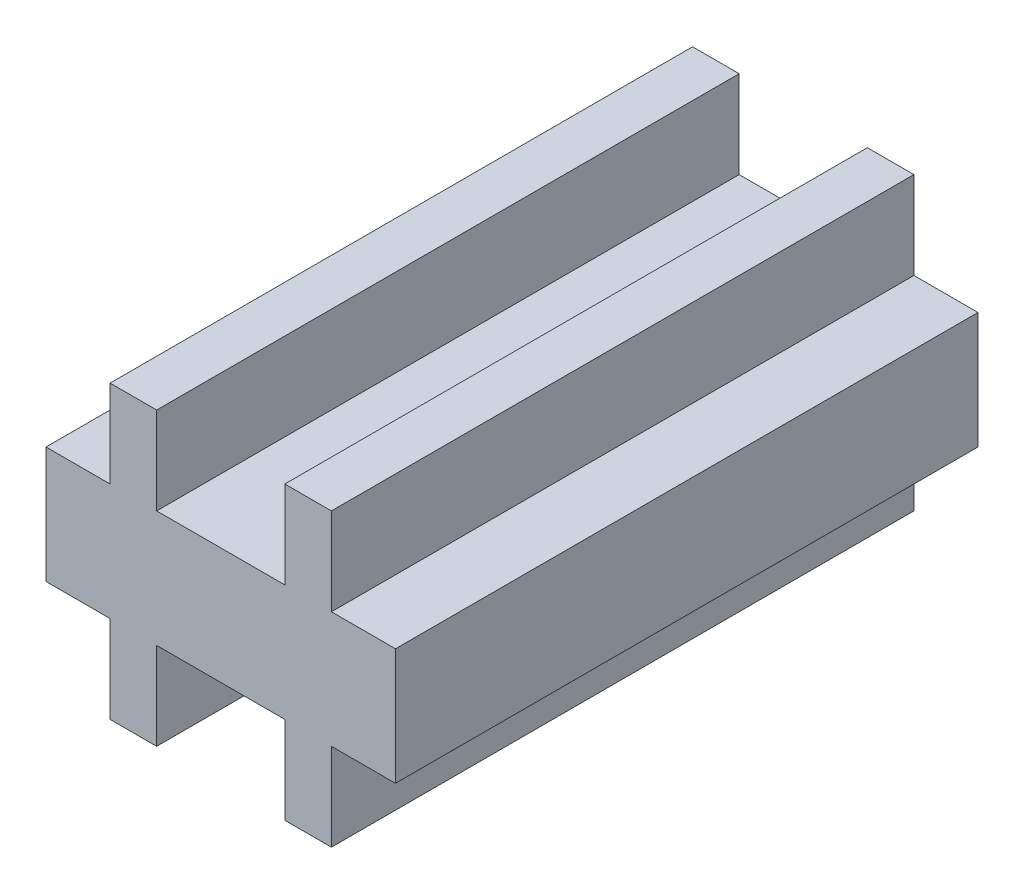
ISO-10303-21;
HEADER;
FILE_DESCRIPTION(('STEP AP214'),'2;1');
FILE_NAME('part.step','',(''),(''),'','','');
FILE_SCHEMA(('AUTOMOTIVE_DESIGN { 1 0 10303 214 1 1 1 1 }'));
ENDSEC;
DATA;
#1=APPLICATION_CONTEXT('core data for automotive mechanical design processes');
#2=APPLICATION_PROTOCOL_DEFINITION('international standard','automotive_design',2000,#1);
#3=PRODUCT_CONTEXT('',#1,'mechanical');
#4=PRODUCT('Part','Part','',(#3));
#5=PRODUCT_RELATED_PRODUCT_CATEGORY('part','',(#4));
#6=PRODUCT_DEFINITION_FORMATION('','',#4);
#7=PRODUCT_DEFINITION_CONTEXT('part definition',#1,'design');
#8=PRODUCT_DEFINITION('design','',#6,#7);
#9=PRODUCT_DEFINITION_SHAPE('','',#8);
#10=(LENGTH_UNIT() NAMED_UNIT(*) SI_UNIT(.MILLI.,.METRE.));
#11=(NAMED_UNIT(*) PLANE_ANGLE_UNIT() SI_UNIT($,.RADIAN.));
#12=(NAMED_UNIT(*) SI_UNIT($,.STERADIAN.) SOLID_ANGLE_UNIT());
#13=UNCERTAINTY_MEASURE_WITH_UNIT(LENGTH_MEASURE(1.E-05),#10,'distance_accuracy_value','');
#14=(GEOMETRIC_REPRESENTATION_CONTEXT(3) GLOBAL_UNCERTAINTY_ASSIGNED_CONTEXT((#13)) GLOBAL_UNIT_ASSIGNED_CONTEXT((#10,
#11,#12)) REPRESENTATION_CONTEXT('',''));
#15=CARTESIAN_POINT('',(0.,0.,0.));
#16=DIRECTION('',(0.,0.,1.));
#17=DIRECTION('',(1.,0.,0.));
#18=AXIS2_PLACEMENT_3D('',#15,#16,#17);
#19=CARTESIAN_POINT('',(0.,10.,100.));
#20=DIRECTION('',(0.,1.,0.));
#21=DIRECTION('',(0.,0.,1.));
#22=AXIS2_PLACEMENT_3D('',#19,#20,#21);
#23=PLANE('',#22);
#24=DIRECTION('',(1.,0.,0.));
#25=VECTOR('',#24,1.);
#26=CARTESIAN_POINT('',(0.,10.,0.));
#27=LINE('',#26,#25);
#28=CARTESIAN_POINT('',(3.99999999999999,10.,0.));
#29=VERTEX_POINT('',#28);
#30=CARTESIAN_POINT('',(15.,10.,0.));
#31=VERTEX_POINT('',#30);
#32=EDGE_CURVE('E147',#29,#31,#27,.T.);
#33=ORIENTED_EDGE('',*,*,#32,.F.);
#34=DIRECTION('',(0.,0.,-1.));
#35=VECTOR('',#34,1.);
#36=CARTESIAN_POINT('',(3.99999999999999,10.,100.));
#37=LINE('',#36,#35);
#38=CARTESIAN_POINT('',(3.99999999999999,10.,100.));
#39=VERTEX_POINT('',#38);
#40=EDGE_CURVE('E11',#39,#29,#37,.T.);
#41=ORIENTED_EDGE('',*,*,#40,.F.);
#42=DIRECTION('',(1.,0.,0.));
#43=VECTOR('',#42,1.);
#44=CARTESIAN_POINT('',(0.,10.,100.));
#45=LINE('',#44,#43);
#46=CARTESIAN_POINT('',(15.,10.,100.));
#47=VERTEX_POINT('',#46);
#48=EDGE_CURVE('E175',#39,#47,#45,.T.);
#49=ORIENTED_EDGE('',*,*,#48,.T.);
#50=DIRECTION('',(0.,0.,-1.));
#51=VECTOR('',#50,1.);
#52=CARTESIAN_POINT('',(15.,10.,100.));
#53=LINE('',#52,#51);
#54=EDGE_CURVE('E95',#47,#31,#53,.T.);
#55=ORIENTED_EDGE('',*,*,#54,.T.);
#56=EDGE_LOOP('',(#33,#41,#49,#55));
#57=FACE_BOUND('',#56,.T.);
#58=ADVANCED_FACE('F37',(#57),#23,.T.);
#59=CARTESIAN_POINT('',(3.99999999999999,0.,100.));
#60=DIRECTION('',(-1.,0.,0.));
#61=DIRECTION('',(0.,0.,1.));
#62=AXIS2_PLACEMENT_3D('',#59,#60,#61);
#63=PLANE('',#62);
#64=DIRECTION('',(0.,1.,0.));
#65=VECTOR('',#64,1.);
#66=CARTESIAN_POINT('',(3.99999999999999,0.,0.));
#67=LINE('',#66,#65);
#68=CARTESIAN_POINT('',(3.99999999999999,25.,0.));
#69=VERTEX_POINT('',#68);
#70=EDGE_CURVE('E150',#29,#69,#67,.T.);
#71=ORIENTED_EDGE('',*,*,#70,.T.);
#72=DIRECTION('',(0.,0.,-1.));
#73=VECTOR('',#72,1.);
#74=CARTESIAN_POINT('',(3.99999999999999,25.,100.));
#75=LINE('',#74,#73);
#76=CARTESIAN_POINT('',(3.99999999999999,25.,100.));
#77=VERTEX_POINT('',#76);
#78=EDGE_CURVE('E45',#77,#69,#75,.T.);
#79=ORIENTED_EDGE('',*,*,#78,.F.);
#80=DIRECTION('',(0.,1.,0.));
#81=VECTOR('',#80,1.);
#82=CARTESIAN_POINT('',(3.99999999999999,0.,100.));
#83=LINE('',#82,#81);
#84=EDGE_CURVE('E208',#39,#77,#83,.T.);
#85=ORIENTED_EDGE('',*,*,#84,.F.);
#86=ORIENTED_EDGE('',*,*,#40,.T.);
#87=EDGE_LOOP('',(#71,#79,#85,#86));
#88=FACE_BOUND('',#87,.T.);
#89=ADVANCED_FACE('F195',(#88),#63,.F.);
#90=CARTESIAN_POINT('',(0.,25.,100.));
#91=DIRECTION('',(0.,1.,0.));
#92=DIRECTION('',(0.,0.,1.));
#93=AXIS2_PLACEMENT_3D('',#90,#91,#92);
#94=PLANE('',#93);
#95=DIRECTION('',(1.,0.,0.));
#96=VECTOR('',#95,1.);
#97=CARTESIAN_POINT('',(0.,25.,0.));
#98=LINE('',#97,#96);
#99=CARTESIAN_POINT('',(-4.00000000000001,25.,0.));
#100=VERTEX_POINT('',#99);
#101=EDGE_CURVE('E154',#100,#69,#98,.T.);
#102=ORIENTED_EDGE('',*,*,#101,.F.);
#103=DIRECTION('',(0.,0.,-1.));
#104=VECTOR('',#103,1.);
#105=CARTESIAN_POINT('',(-4.00000000000001,25.,100.));
#106=LINE('',#105,#104);
#107=CARTESIAN_POINT('',(-4.00000000000001,25.,100.));
#108=VERTEX_POINT('',#107);
#109=EDGE_CURVE('E185',#108,#100,#106,.T.);
#110=ORIENTED_EDGE('',*,*,#109,.F.);
#111=DIRECTION('',(1.,0.,0.));
#112=VECTOR('',#111,1.);
#113=CARTESIAN_POINT('',(0.,25.,100.));
#114=LINE('',#113,#112);
#115=EDGE_CURVE('E192',#108,#77,#114,.T.);
#116=ORIENTED_EDGE('',*,*,#115,.T.);
#117=ORIENTED_EDGE('',*,*,#78,.T.);
#118=EDGE_LOOP('',(#102,#110,#116,#117));
#119=FACE_BOUND('',#118,.T.);
#120=ADVANCED_FACE('F190',(#119),#94,.T.);
#121=CARTESIAN_POINT('',(-4.00000000000001,0.,100.));
#122=DIRECTION('',(-1.,0.,0.));
#123=DIRECTION('',(0.,0.,1.));
#124=AXIS2_PLACEMENT_3D('',#121,#122,#123);
#125=PLANE('',#124);
#126=DIRECTION('',(0.,1.,0.));
#127=VECTOR('',#126,1.);
#128=CARTESIAN_POINT('',(-4.00000000000001,0.,0.));
#129=LINE('',#128,#127);
#130=CARTESIAN_POINT('',(-4.00000000000001,10.,0.));
#131=VERTEX_POINT('',#130);
#132=EDGE_CURVE('E157',#131,#100,#129,.T.);
#133=ORIENTED_EDGE('',*,*,#132,.F.);
#134=DIRECTION('',(0.,0.,-1.));
#135=VECTOR('',#134,1.);
#136=CARTESIAN_POINT('',(-4.00000000000001,10.,100.));
#137=LINE('',#136,#135);
#138=CARTESIAN_POINT('',(-4.00000000000001,10.,100.));
#139=VERTEX_POINT('',#138);
#140=EDGE_CURVE('E183',#139,#131,#137,.T.);
#141=ORIENTED_EDGE('',*,*,#140,.F.);
#142=DIRECTION('',(0.,1.,0.));
#143=VECTOR('',#142,1.);
#144=CARTESIAN_POINT('',(-4.00000000000001,0.,100.));
#145=LINE('',#144,#143);
#146=EDGE_CURVE('E205',#139,#108,#145,.T.);
#147=ORIENTED_EDGE('',*,*,#146,.T.);
#148=ORIENTED_EDGE('',*,*,#109,.T.);
#149=EDGE_LOOP('',(#133,#141,#147,#148));
#150=FACE_BOUND('',#149,.T.);
#151=ADVANCED_FACE('F202',(#150),#125,.T.);
#152=CARTESIAN_POINT('',(0.,10.,100.));
#153=DIRECTION('',(0.,1.,0.));
#154=DIRECTION('',(0.,0.,1.));
#155=AXIS2_PLACEMENT_3D('',#152,#153,#154);
#156=PLANE('',#155);
#157=DIRECTION('',(1.,0.,0.));
#158=VECTOR('',#157,1.);
#159=CARTESIAN_POINT('',(0.,10.,0.));
#160=LINE('',#159,#158);
#161=CARTESIAN_POINT('',(-26.,10.,0.));
#162=VERTEX_POINT('',#161);
#163=EDGE_CURVE('E160',#162,#131,#160,.T.);
#164=ORIENTED_EDGE('',*,*,#163,.F.);
#165=DIRECTION('',(0.,0.,-1.));
#166=VECTOR('',#165,1.);
#167=CARTESIAN_POINT('',(-26.,10.,100.));
#168=LINE('',#167,#166);
#169=CARTESIAN_POINT('',(-26.,10.,100.));
#170=VERTEX_POINT('',#169);
#171=EDGE_CURVE('E273',#170,#162,#168,.T.);
#172=ORIENTED_EDGE('',*,*,#171,.F.);
#173=DIRECTION('',(1.,0.,0.));
#174=VECTOR('',#173,1.);
#175=CARTESIAN_POINT('',(0.,10.,100.));
#176=LINE('',#175,#174);
#177=EDGE_CURVE('E210',#170,#139,#176,.T.);
#178=ORIENTED_EDGE('',*,*,#177,.T.);
#179=ORIENTED_EDGE('',*,*,#140,.T.);
#180=EDGE_LOOP('',(#164,#172,#178,#179));
#181=FACE_BOUND('',#180,.T.);
#182=ADVANCED_FACE('F535',(#181),#156,.T.);
#183=CARTESIAN_POINT('',(0.,-10.,100.));
#184=DIRECTION('',(0.,1.,0.));
#185=DIRECTION('',(0.,0.,1.));
#186=AXIS2_PLACEMENT_3D('',#183,#184,#185);
#187=PLANE('',#186);
#188=DIRECTION('',(1.,0.,0.));
#189=VECTOR('',#188,1.);
#190=CARTESIAN_POINT('',(0.,-10.,0.));
#191=LINE('',#190,#189);
#192=CARTESIAN_POINT('',(-26.,-10.,0.));
#193=VERTEX_POINT('',#192);
#194=CARTESIAN_POINT('',(-4.00000000000001,-10.,0.));
#195=VERTEX_POINT('',#194);
#196=EDGE_CURVE('E163',#193,#195,#191,.T.);
#197=ORIENTED_EDGE('',*,*,#196,.T.);
#198=DIRECTION('',(0.,0.,-1.));
#199=VECTOR('',#198,1.);
#200=CARTESIAN_POINT('',(-4.00000000000001,-10.,100.));
#201=LINE('',#200,#199);
#202=CARTESIAN_POINT('',(-4.00000000000001,-10.,100.));
#203=VERTEX_POINT('',#202);
#204=EDGE_CURVE('E181',#203,#195,#201,.T.);
#205=ORIENTED_EDGE('',*,*,#204,.F.);
#206=DIRECTION('',(1.,0.,0.));
#207=VECTOR('',#206,1.);
#208=CARTESIAN_POINT('',(0.,-10.,100.));
#209=LINE('',#208,#207);
#210=CARTESIAN_POINT('',(-26.,-10.,100.));
#211=VERTEX_POINT('',#210);
#212=EDGE_CURVE('E216',#211,#203,#209,.T.);
#213=ORIENTED_EDGE('',*,*,#212,.F.);
#214=DIRECTION('',(0.,0.,-1.));
#215=VECTOR('',#214,1.);
#216=CARTESIAN_POINT('',(-26.,-10.,100.));
#217=LINE('',#216,#215);
#218=EDGE_CURVE('E236',#211,#193,#217,.T.);
#219=ORIENTED_EDGE('',*,*,#218,.T.);
#220=EDGE_LOOP('',(#197,#205,#213,#219));
#221=FACE_BOUND('',#220,.T.);
#222=ADVANCED_FACE('F233',(#221),#187,.F.);
#223=CARTESIAN_POINT('',(-4.00000000000001,0.,100.));
#224=DIRECTION('',(-1.,0.,0.));
#225=DIRECTION('',(0.,0.,1.));
#226=AXIS2_PLACEMENT_3D('',#223,#224,#225);
#227=PLANE('',#226);
#228=DIRECTION('',(0.,1.,0.));
#229=VECTOR('',#228,1.);
#230=CARTESIAN_POINT('',(-4.00000000000001,0.,0.));
#231=LINE('',#230,#229);
#232=CARTESIAN_POINT('',(-4.00000000000001,-25.,0.));
#233=VERTEX_POINT('',#232);
#234=EDGE_CURVE('E166',#233,#195,#231,.T.);
#235=ORIENTED_EDGE('',*,*,#234,.F.);
#236=DIRECTION('',(0.,0.,-1.));
#237=VECTOR('',#236,1.);
#238=CARTESIAN_POINT('',(-4.00000000000001,-25.,100.));
#239=LINE('',#238,#237);
#240=CARTESIAN_POINT('',(-4.00000000000001,-25.,100.));
#241=VERTEX_POINT('',#240);
#242=EDGE_CURVE('E179',#241,#233,#239,.T.);
#243=ORIENTED_EDGE('',*,*,#242,.F.);
#244=DIRECTION('',(0.,1.,0.));
#245=VECTOR('',#244,1.);
#246=CARTESIAN_POINT('',(-4.00000000000001,0.,100.));
#247=LINE('',#246,#245);
#248=EDGE_CURVE('E218',#241,#203,#247,.T.);
#249=ORIENTED_EDGE('',*,*,#248,.T.);
#250=ORIENTED_EDGE('',*,*,#204,.T.);
#251=EDGE_LOOP('',(#235,#243,#249,#250));
#252=FACE_BOUND('',#251,.T.);
#253=ADVANCED_FACE('F222',(#252),#227,.T.);
#254=CARTESIAN_POINT('',(0.,-25.,100.));
#255=DIRECTION('',(0.,1.,0.));
#256=DIRECTION('',(0.,0.,1.));
#257=AXIS2_PLACEMENT_3D('',#254,#255,#256);
#258=PLANE('',#257);
#259=DIRECTION('',(1.,0.,0.));
#260=VECTOR('',#259,1.);
#261=CARTESIAN_POINT('',(0.,-25.,0.));
#262=LINE('',#261,#260);
#263=CARTESIAN_POINT('',(3.99999999999999,-25.,0.));
#264=VERTEX_POINT('',#263);
#265=EDGE_CURVE('E169',#233,#264,#262,.T.);
#266=ORIENTED_EDGE('',*,*,#265,.T.);
#267=DIRECTION('',(0.,0.,-1.));
#268=VECTOR('',#267,1.);
#269=CARTESIAN_POINT('',(3.99999999999999,-25.,100.));
#270=LINE('',#269,#268);
#271=CARTESIAN_POINT('',(3.99999999999999,-25.,100.));
#272=VERTEX_POINT('',#271);
#273=EDGE_CURVE('E139',#272,#264,#270,.T.);
#274=ORIENTED_EDGE('',*,*,#273,.F.);
#275=DIRECTION('',(1.,0.,0.));
#276=VECTOR('',#275,1.);
#277=CARTESIAN_POINT('',(0.,-25.,100.));
#278=LINE('',#277,#276);
#279=EDGE_CURVE('E130',#241,#272,#278,.T.);
#280=ORIENTED_EDGE('',*,*,#279,.F.);
#281=ORIENTED_EDGE('',*,*,#242,.T.);
#282=EDGE_LOOP('',(#266,#274,#280,#281));
#283=FACE_BOUND('',#282,.T.);
#284=ADVANCED_FACE('F241',(#283),#258,.F.);
#285=CARTESIAN_POINT('',(3.99999999999999,0.,100.));
#286=DIRECTION('',(-1.,0.,0.));
#287=DIRECTION('',(0.,0.,1.));
#288=AXIS2_PLACEMENT_3D('',#285,#286,#287);
#289=PLANE('',#288);
#290=DIRECTION('',(0.,1.,0.));
#291=VECTOR('',#290,1.);
#292=CARTESIAN_POINT('',(3.99999999999999,0.,0.));
#293=LINE('',#292,#291);
#294=CARTESIAN_POINT('',(3.99999999999999,-10.,0.));
#295=VERTEX_POINT('',#294);
#296=EDGE_CURVE('E138',#264,#295,#293,.T.);
#297=ORIENTED_EDGE('',*,*,#296,.T.);
#298=DIRECTION('',(0.,0.,-1.));
#299=VECTOR('',#298,1.);
#300=CARTESIAN_POINT('',(3.99999999999999,-10.,100.));
#301=LINE('',#300,#299);
#302=CARTESIAN_POINT('',(3.99999999999999,-10.,100.));
#303=VERTEX_POINT('',#302);
#304=EDGE_CURVE('E135',#303,#295,#301,.T.);
#305=ORIENTED_EDGE('',*,*,#304,.F.);
#306=DIRECTION('',(0.,1.,0.));
#307=VECTOR('',#306,1.);
#308=CARTESIAN_POINT('',(3.99999999999999,0.,100.));
#309=LINE('',#308,#307);
#310=EDGE_CURVE('E123',#272,#303,#309,.T.);
#311=ORIENTED_EDGE('',*,*,#310,.F.);
#312=ORIENTED_EDGE('',*,*,#273,.T.);
#313=EDGE_LOOP('',(#297,#305,#311,#312));
#314=FACE_BOUND('',#313,.T.);
#315=ADVANCED_FACE('F136',(#314),#289,.F.);
#316=CARTESIAN_POINT('',(0.,-10.,100.));
#317=DIRECTION('',(0.,1.,0.));
#318=DIRECTION('',(0.,0.,1.));
#319=AXIS2_PLACEMENT_3D('',#316,#317,#318);
#320=PLANE('',#319);
#321=DIRECTION('',(1.,0.,0.));
#322=VECTOR('',#321,1.);
#323=CARTESIAN_POINT('',(0.,-10.,0.));
#324=LINE('',#323,#322);
#325=CARTESIAN_POINT('',(15.,-10.,0.));
#326=VERTEX_POINT('',#325);
#327=EDGE_CURVE('E88',#295,#326,#324,.T.);
#328=ORIENTED_EDGE('',*,*,#327,.T.);
#329=DIRECTION('',(0.,0.,-1.));
#330=VECTOR('',#329,1.);
#331=CARTESIAN_POINT('',(15.,-10.,100.));
#332=LINE('',#331,#330);
#333=CARTESIAN_POINT('',(15.,-10.,100.));
#334=VERTEX_POINT('',#333);
#335=EDGE_CURVE('E140',#334,#326,#332,.T.);
#336=ORIENTED_EDGE('',*,*,#335,.F.);
#337=DIRECTION('',(1.,0.,0.));
#338=VECTOR('',#337,1.);
#339=CARTESIAN_POINT('',(0.,-10.,100.));
#340=LINE('',#339,#338);
#341=EDGE_CURVE('E127',#303,#334,#340,.T.);
#342=ORIENTED_EDGE('',*,*,#341,.F.);
#343=ORIENTED_EDGE('',*,*,#304,.T.);
#344=EDGE_LOOP('',(#328,#336,#342,#343));
#345=FACE_BOUND('',#344,.T.);
#346=ADVANCED_FACE('F142',(#345),#320,.F.);
#347=CARTESIAN_POINT('',(15.,0.,100.));
#348=DIRECTION('',(-1.,0.,0.));
#349=DIRECTION('',(0.,0.,1.));
#350=AXIS2_PLACEMENT_3D('',#347,#348,#349);
#351=PLANE('',#350);
#352=DIRECTION('',(0.,1.,0.));
#353=VECTOR('',#352,1.);
#354=CARTESIAN_POINT('',(15.,0.,0.));
#355=LINE('',#354,#353);
#356=EDGE_CURVE('E173',#326,#31,#355,.T.);
#357=ORIENTED_EDGE('',*,*,#356,.T.);
#358=ORIENTED_EDGE('',*,*,#54,.F.);
#359=DIRECTION('',(0.,1.,0.));
#360=VECTOR('',#359,1.);
#361=CARTESIAN_POINT('',(15.,0.,100.));
#362=LINE('',#361,#360);
#363=EDGE_CURVE('E53',#334,#47,#362,.T.);
#364=ORIENTED_EDGE('',*,*,#363,.F.);
#365=ORIENTED_EDGE('',*,*,#335,.T.);
#366=EDGE_LOOP('',(#357,#358,#364,#365));
#367=FACE_BOUND('',#366,.T.);
#368=ADVANCED_FACE('F256',(#367),#351,.F.);
#369=CARTESIAN_POINT('',(0.,0.,100.));
#370=DIRECTION('',(0.,0.,1.));
#371=DIRECTION('',(1.,0.,0.));
#372=AXIS2_PLACEMENT_3D('',#369,#370,#371);
#373=PLANE('',#372);
#374=ORIENTED_EDGE('',*,*,#48,.F.);
#375=ORIENTED_EDGE('',*,*,#84,.T.);
#376=ORIENTED_EDGE('',*,*,#115,.F.);
#377=ORIENTED_EDGE('',*,*,#146,.F.);
#378=ORIENTED_EDGE('',*,*,#177,.F.);
#379=DIRECTION('',(0.,1.,0.));
#380=VECTOR('',#379,1.);
#381=CARTESIAN_POINT('',(-26.,0.,100.));
#382=LINE('',#381,#380);
#383=CARTESIAN_POINT('',(-26.,25.,100.));
#384=VERTEX_POINT('',#383);
#385=EDGE_CURVE('E318',#170,#384,#382,.T.);
#386=ORIENTED_EDGE('',*,*,#385,.T.);
#387=DIRECTION('',(-1.,0.,0.));
#388=VECTOR('',#387,1.);
#389=CARTESIAN_POINT('',(-30.,25.,100.));
#390=LINE('',#389,#388);
#391=CARTESIAN_POINT('',(-34.,25.,100.));
#392=VERTEX_POINT('',#391);
#393=EDGE_CURVE('E315',#384,#392,#390,.T.);
#394=ORIENTED_EDGE('',*,*,#393,.T.);
#395=DIRECTION('',(0.,1.,0.));
#396=VECTOR('',#395,1.);
#397=CARTESIAN_POINT('',(-34.,0.,100.));
#398=LINE('',#397,#396);
#399=CARTESIAN_POINT('',(-34.,10.,100.));
#400=VERTEX_POINT('',#399);
#401=EDGE_CURVE('E285',#400,#392,#398,.T.);
#402=ORIENTED_EDGE('',*,*,#401,.F.);
#403=DIRECTION('',(-1.,0.,0.));
#404=VECTOR('',#403,1.);
#405=CARTESIAN_POINT('',(-30.,10.,100.));
#406=LINE('',#405,#404);
#407=CARTESIAN_POINT('',(-45.,10.,100.));
#408=VERTEX_POINT('',#407);
#409=EDGE_CURVE('E289',#400,#408,#406,.T.);
#410=ORIENTED_EDGE('',*,*,#409,.T.);
#411=DIRECTION('',(0.,1.,0.));
#412=VECTOR('',#411,1.);
#413=CARTESIAN_POINT('',(-45.,0.,100.));
#414=LINE('',#413,#412);
#415=CARTESIAN_POINT('',(-45.,-10.,100.));
#416=VERTEX_POINT('',#415);
#417=EDGE_CURVE('E331',#416,#408,#414,.T.);
#418=ORIENTED_EDGE('',*,*,#417,.F.);
#419=DIRECTION('',(-1.,0.,0.));
#420=VECTOR('',#419,1.);
#421=CARTESIAN_POINT('',(-30.,-10.,100.));
#422=LINE('',#421,#420);
#423=CARTESIAN_POINT('',(-34.,-10.,100.));
#424=VERTEX_POINT('',#423);
#425=EDGE_CURVE('E328',#424,#416,#422,.T.);
#426=ORIENTED_EDGE('',*,*,#425,.F.);
#427=DIRECTION('',(0.,1.,0.));
#428=VECTOR('',#427,1.);
#429=CARTESIAN_POINT('',(-34.,0.,100.));
#430=LINE('',#429,#428);
#431=CARTESIAN_POINT('',(-34.,-25.,100.));
#432=VERTEX_POINT('',#431);
#433=EDGE_CURVE('E325',#432,#424,#430,.T.);
#434=ORIENTED_EDGE('',*,*,#433,.F.);
#435=DIRECTION('',(-1.,0.,0.));
#436=VECTOR('',#435,1.);
#437=CARTESIAN_POINT('',(-30.,-25.,100.));
#438=LINE('',#437,#436);
#439=CARTESIAN_POINT('',(-26.,-25.,100.));
#440=VERTEX_POINT('',#439);
#441=EDGE_CURVE('E322',#440,#432,#438,.T.);
#442=ORIENTED_EDGE('',*,*,#441,.F.);
#443=DIRECTION('',(0.,1.,0.));
#444=VECTOR('',#443,1.);
#445=CARTESIAN_POINT('',(-26.,0.,100.));
#446=LINE('',#445,#444);
#447=EDGE_CURVE('E229',#440,#211,#446,.T.);
#448=ORIENTED_EDGE('',*,*,#447,.T.);
#449=ORIENTED_EDGE('',*,*,#212,.T.);
#450=ORIENTED_EDGE('',*,*,#248,.F.);
#451=ORIENTED_EDGE('',*,*,#279,.T.);
#452=ORIENTED_EDGE('',*,*,#310,.T.);
#453=ORIENTED_EDGE('',*,*,#341,.T.);
#454=ORIENTED_EDGE('',*,*,#363,.T.);
#455=EDGE_LOOP('',(#374,#375,#376,#377,#378,#386,#394,#402,#410,#418,#426,#434,#442,#448,#449,
#450,#451,#452,#453,#454));
#456=FACE_BOUND('',#455,.T.);
#457=ADVANCED_FACE('F125',(#456),#373,.T.);
#458=CARTESIAN_POINT('',(0.,0.,0.));
#459=DIRECTION('',(0.,0.,1.));
#460=DIRECTION('',(1.,0.,0.));
#461=AXIS2_PLACEMENT_3D('',#458,#459,#460);
#462=PLANE('',#461);
#463=ORIENTED_EDGE('',*,*,#32,.T.);
#464=ORIENTED_EDGE('',*,*,#356,.F.);
#465=ORIENTED_EDGE('',*,*,#327,.F.);
#466=ORIENTED_EDGE('',*,*,#296,.F.);
#467=ORIENTED_EDGE('',*,*,#265,.F.);
#468=ORIENTED_EDGE('',*,*,#234,.T.);
#469=ORIENTED_EDGE('',*,*,#196,.F.);
#470=DIRECTION('',(0.,1.,0.));
#471=VECTOR('',#470,1.);
#472=CARTESIAN_POINT('',(-26.,0.,0.));
#473=LINE('',#472,#471);
#474=CARTESIAN_POINT('',(-26.,-25.,0.));
#475=VERTEX_POINT('',#474);
#476=EDGE_CURVE('E296',#475,#193,#473,.T.);
#477=ORIENTED_EDGE('',*,*,#476,.F.);
#478=DIRECTION('',(-1.,0.,0.));
#479=VECTOR('',#478,1.);
#480=CARTESIAN_POINT('',(-30.,-25.,0.));
#481=LINE('',#480,#479);
#482=CARTESIAN_POINT('',(-34.,-25.,0.));
#483=VERTEX_POINT('',#482);
#484=EDGE_CURVE('E298',#475,#483,#481,.T.);
#485=ORIENTED_EDGE('',*,*,#484,.T.);
#486=DIRECTION('',(0.,1.,0.));
#487=VECTOR('',#486,1.);
#488=CARTESIAN_POINT('',(-34.,0.,0.));
#489=LINE('',#488,#487);
#490=CARTESIAN_POINT('',(-34.,-10.,0.));
#491=VERTEX_POINT('',#490);
#492=EDGE_CURVE('E301',#483,#491,#489,.T.);
#493=ORIENTED_EDGE('',*,*,#492,.T.);
#494=DIRECTION('',(-1.,0.,0.));
#495=VECTOR('',#494,1.);
#496=CARTESIAN_POINT('',(-30.,-10.,0.));
#497=LINE('',#496,#495);
#498=CARTESIAN_POINT('',(-45.,-10.,0.));
#499=VERTEX_POINT('',#498);
#500=EDGE_CURVE('E304',#491,#499,#497,.T.);
#501=ORIENTED_EDGE('',*,*,#500,.T.);
#502=DIRECTION('',(0.,1.,0.));
#503=VECTOR('',#502,1.);
#504=CARTESIAN_POINT('',(-45.,0.,0.));
#505=LINE('',#504,#503);
#506=CARTESIAN_POINT('',(-45.,10.,0.));
#507=VERTEX_POINT('',#506);
#508=EDGE_CURVE('E307',#499,#507,#505,.T.);
#509=ORIENTED_EDGE('',*,*,#508,.T.);
#510=DIRECTION('',(-1.,0.,0.));
#511=VECTOR('',#510,1.);
#512=CARTESIAN_POINT('',(-30.,10.,0.));
#513=LINE('',#512,#511);
#514=CARTESIAN_POINT('',(-34.,10.,0.));
#515=VERTEX_POINT('',#514);
#516=EDGE_CURVE('E310',#515,#507,#513,.T.);
#517=ORIENTED_EDGE('',*,*,#516,.F.);
#518=DIRECTION('',(0.,1.,0.));
#519=VECTOR('',#518,1.);
#520=CARTESIAN_POINT('',(-34.,0.,0.));
#521=LINE('',#520,#519);
#522=CARTESIAN_POINT('',(-34.,25.,0.));
#523=VERTEX_POINT('',#522);
#524=EDGE_CURVE('E286',#515,#523,#521,.T.);
#525=ORIENTED_EDGE('',*,*,#524,.T.);
#526=DIRECTION('',(-1.,0.,0.));
#527=VECTOR('',#526,1.);
#528=CARTESIAN_POINT('',(-30.,25.,0.));
#529=LINE('',#528,#527);
#530=CARTESIAN_POINT('',(-26.,25.,0.));
#531=VERTEX_POINT('',#530);
#532=EDGE_CURVE('E290',#531,#523,#529,.T.);
#533=ORIENTED_EDGE('',*,*,#532,.F.);
#534=DIRECTION('',(0.,1.,0.));
#535=VECTOR('',#534,1.);
#536=CARTESIAN_POINT('',(-26.,0.,0.));
#537=LINE('',#536,#535);
#538=EDGE_CURVE('E293',#162,#531,#537,.T.);
#539=ORIENTED_EDGE('',*,*,#538,.F.);
#540=ORIENTED_EDGE('',*,*,#163,.T.);
#541=ORIENTED_EDGE('',*,*,#132,.T.);
#542=ORIENTED_EDGE('',*,*,#101,.T.);
#543=ORIENTED_EDGE('',*,*,#70,.F.);
#544=EDGE_LOOP('',(#463,#464,#465,#466,#467,#468,#469,#477,#485,#493,#501,#509,#517,#525,#533,
#539,#540,#541,#542,#543));
#545=FACE_BOUND('',#544,.T.);
#546=ADVANCED_FACE('F197',(#545),#462,.F.);
#547=CARTESIAN_POINT('',(-30.,10.,100.));
#548=DIRECTION('',(0.,-1.,0.));
#549=DIRECTION('',(0.,0.,-1.));
#550=AXIS2_PLACEMENT_3D('',#547,#548,#549);
#551=PLANE('',#550);
#552=ORIENTED_EDGE('',*,*,#516,.T.);
#553=DIRECTION('',(0.,0.,-1.));
#554=VECTOR('',#553,1.);
#555=CARTESIAN_POINT('',(-45.,10.,100.));
#556=LINE('',#555,#554);
#557=EDGE_CURVE('E151',#408,#507,#556,.T.);
#558=ORIENTED_EDGE('',*,*,#557,.F.);
#559=ORIENTED_EDGE('',*,*,#409,.F.);
#560=DIRECTION('',(0.,0.,-1.));
#561=VECTOR('',#560,1.);
#562=CARTESIAN_POINT('',(-34.,10.,100.));
#563=LINE('',#562,#561);
#564=EDGE_CURVE('E282',#400,#515,#563,.T.);
#565=ORIENTED_EDGE('',*,*,#564,.T.);
#566=EDGE_LOOP('',(#552,#558,#559,#565));
#567=FACE_BOUND('',#566,.T.);
#568=ADVANCED_FACE('F344',(#567),#551,.F.);
#569=CARTESIAN_POINT('',(-45.,0.,100.));
#570=DIRECTION('',(-1.,0.,0.));
#571=DIRECTION('',(0.,0.,1.));
#572=AXIS2_PLACEMENT_3D('',#569,#570,#571);
#573=PLANE('',#572);
#574=ORIENTED_EDGE('',*,*,#508,.F.);
#575=DIRECTION('',(0.,0.,-1.));
#576=VECTOR('',#575,1.);
#577=CARTESIAN_POINT('',(-45.,-10.,100.));
#578=LINE('',#577,#576);
#579=EDGE_CURVE('E260',#416,#499,#578,.T.);
#580=ORIENTED_EDGE('',*,*,#579,.F.);
#581=ORIENTED_EDGE('',*,*,#417,.T.);
#582=ORIENTED_EDGE('',*,*,#557,.T.);
#583=EDGE_LOOP('',(#574,#580,#581,#582));
#584=FACE_BOUND('',#583,.T.);
#585=ADVANCED_FACE('F350',(#584),#573,.T.);
#586=CARTESIAN_POINT('',(-30.,-10.,100.));
#587=DIRECTION('',(0.,-1.,0.));
#588=DIRECTION('',(0.,0.,-1.));
#589=AXIS2_PLACEMENT_3D('',#586,#587,#588);
#590=PLANE('',#589);
#591=ORIENTED_EDGE('',*,*,#500,.F.);
#592=DIRECTION('',(0.,0.,-1.));
#593=VECTOR('',#592,1.);
#594=CARTESIAN_POINT('',(-34.,-10.,100.));
#595=LINE('',#594,#593);
#596=EDGE_CURVE('E263',#424,#491,#595,.T.);
#597=ORIENTED_EDGE('',*,*,#596,.F.);
#598=ORIENTED_EDGE('',*,*,#425,.T.);
#599=ORIENTED_EDGE('',*,*,#579,.T.);
#600=EDGE_LOOP('',(#591,#597,#598,#599));
#601=FACE_BOUND('',#600,.T.);
#602=ADVANCED_FACE('F356',(#601),#590,.T.);
#603=CARTESIAN_POINT('',(-34.,0.,100.));
#604=DIRECTION('',(-1.,0.,0.));
#605=DIRECTION('',(0.,0.,1.));
#606=AXIS2_PLACEMENT_3D('',#603,#604,#605);
#607=PLANE('',#606);
#608=ORIENTED_EDGE('',*,*,#492,.F.);
#609=DIRECTION('',(0.,0.,-1.));
#610=VECTOR('',#609,1.);
#611=CARTESIAN_POINT('',(-34.,-25.,100.));
#612=LINE('',#611,#610);
#613=EDGE_CURVE('E266',#432,#483,#612,.T.);
#614=ORIENTED_EDGE('',*,*,#613,.F.);
#615=ORIENTED_EDGE('',*,*,#433,.T.);
#616=ORIENTED_EDGE('',*,*,#596,.T.);
#617=EDGE_LOOP('',(#608,#614,#615,#616));
#618=FACE_BOUND('',#617,.T.);
#619=ADVANCED_FACE('F399',(#618),#607,.T.);
#620=CARTESIAN_POINT('',(-30.,-25.,100.));
#621=DIRECTION('',(0.,-1.,0.));
#622=DIRECTION('',(0.,0.,-1.));
#623=AXIS2_PLACEMENT_3D('',#620,#621,#622);
#624=PLANE('',#623);
#625=ORIENTED_EDGE('',*,*,#484,.F.);
#626=DIRECTION('',(0.,0.,-1.));
#627=VECTOR('',#626,1.);
#628=CARTESIAN_POINT('',(-26.,-25.,100.));
#629=LINE('',#628,#627);
#630=EDGE_CURVE('E269',#440,#475,#629,.T.);
#631=ORIENTED_EDGE('',*,*,#630,.F.);
#632=ORIENTED_EDGE('',*,*,#441,.T.);
#633=ORIENTED_EDGE('',*,*,#613,.T.);
#634=EDGE_LOOP('',(#625,#631,#632,#633));
#635=FACE_BOUND('',#634,.T.);
#636=ADVANCED_FACE('F395',(#635),#624,.T.);
#637=CARTESIAN_POINT('',(-26.,0.,100.));
#638=DIRECTION('',(-1.,0.,0.));
#639=DIRECTION('',(0.,0.,1.));
#640=AXIS2_PLACEMENT_3D('',#637,#638,#639);
#641=PLANE('',#640);
#642=ORIENTED_EDGE('',*,*,#476,.T.);
#643=ORIENTED_EDGE('',*,*,#218,.F.);
#644=ORIENTED_EDGE('',*,*,#447,.F.);
#645=ORIENTED_EDGE('',*,*,#630,.T.);
#646=EDGE_LOOP('',(#642,#643,#644,#645));
#647=FACE_BOUND('',#646,.T.);
#648=ADVANCED_FACE('F391',(#647),#641,.F.);
#649=CARTESIAN_POINT('',(-26.,0.,100.));
#650=DIRECTION('',(-1.,0.,0.));
#651=DIRECTION('',(0.,0.,1.));
#652=AXIS2_PLACEMENT_3D('',#649,#650,#651);
#653=PLANE('',#652);
#654=ORIENTED_EDGE('',*,*,#538,.T.);
#655=DIRECTION('',(0.,0.,-1.));
#656=VECTOR('',#655,1.);
#657=CARTESIAN_POINT('',(-26.,25.,100.));
#658=LINE('',#657,#656);
#659=EDGE_CURVE('E276',#384,#531,#658,.T.);
#660=ORIENTED_EDGE('',*,*,#659,.F.);
#661=ORIENTED_EDGE('',*,*,#385,.F.);
#662=ORIENTED_EDGE('',*,*,#171,.T.);
#663=EDGE_LOOP('',(#654,#660,#661,#662));
#664=FACE_BOUND('',#663,.T.);
#665=ADVANCED_FACE('F385',(#664),#653,.F.);
#666=CARTESIAN_POINT('',(-30.,25.,100.));
#667=DIRECTION('',(0.,-1.,0.));
#668=DIRECTION('',(0.,0.,-1.));
#669=AXIS2_PLACEMENT_3D('',#666,#667,#668);
#670=PLANE('',#669);
#671=ORIENTED_EDGE('',*,*,#532,.T.);
#672=DIRECTION('',(0.,0.,-1.));
#673=VECTOR('',#672,1.);
#674=CARTESIAN_POINT('',(-34.,25.,100.));
#675=LINE('',#674,#673);
#676=EDGE_CURVE('E279',#392,#523,#675,.T.);
#677=ORIENTED_EDGE('',*,*,#676,.F.);
#678=ORIENTED_EDGE('',*,*,#393,.F.);
#679=ORIENTED_EDGE('',*,*,#659,.T.);
#680=EDGE_LOOP('',(#671,#677,#678,#679));
#681=FACE_BOUND('',#680,.T.);
#682=ADVANCED_FACE('F380',(#681),#670,.F.);
#683=CARTESIAN_POINT('',(-34.,0.,100.));
#684=DIRECTION('',(-1.,0.,0.));
#685=DIRECTION('',(0.,0.,1.));
#686=AXIS2_PLACEMENT_3D('',#683,#684,#685);
#687=PLANE('',#686);
#688=ORIENTED_EDGE('',*,*,#524,.F.);
#689=ORIENTED_EDGE('',*,*,#564,.F.);
#690=ORIENTED_EDGE('',*,*,#401,.T.);
#691=ORIENTED_EDGE('',*,*,#676,.T.);
#692=EDGE_LOOP('',(#688,#689,#690,#691));
#693=FACE_BOUND('',#692,.T.);
#694=ADVANCED_FACE('F378',(#693),#687,.T.);
#695=CLOSED_SHELL('',(#58,#89,#120,#151,#182,#222,#253,#284,#315,#346,#368,#457,#546,#568,#585,
#602,#619,#636,#648,#665,#682,#694));
#696=MANIFOLD_SOLID_BREP('B2',#695);
#697=ADVANCED_BREP_SHAPE_REPRESENTATION('',(#18,#696),#14);
#698=SHAPE_DEFINITION_REPRESENTATION(#9,#697);
ENDSEC;
END-ISO-10303-21;
